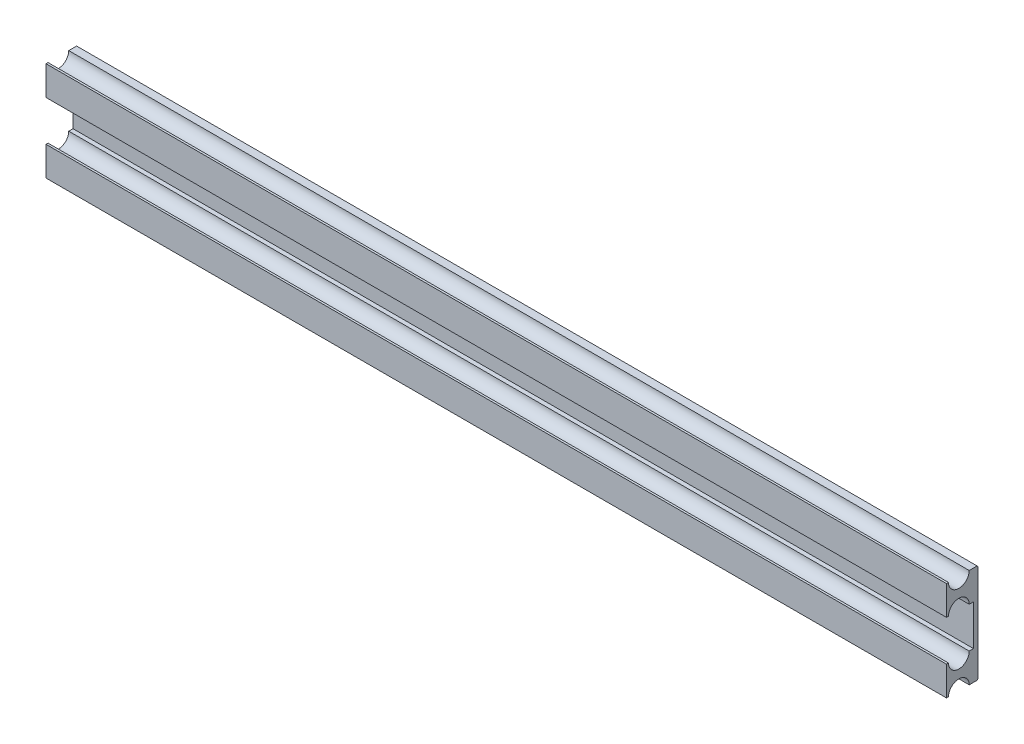
ISO-10303-21;
HEADER;
FILE_DESCRIPTION(('STEP AP214'),'2;1');
FILE_NAME('part.step','',(''),(''),'','','');
FILE_SCHEMA(('AUTOMOTIVE_DESIGN { 1 0 10303 214 1 1 1 1 }'));
ENDSEC;
DATA;
#1=APPLICATION_CONTEXT('core data for automotive mechanical design processes');
#2=APPLICATION_PROTOCOL_DEFINITION('international standard','automotive_design',2000,#1);
#3=PRODUCT_CONTEXT('',#1,'mechanical');
#4=PRODUCT('Part','Part','',(#3));
#5=PRODUCT_RELATED_PRODUCT_CATEGORY('part','',(#4));
#6=PRODUCT_DEFINITION_FORMATION('','',#4);
#7=PRODUCT_DEFINITION_CONTEXT('part definition',#1,'design');
#8=PRODUCT_DEFINITION('design','',#6,#7);
#9=PRODUCT_DEFINITION_SHAPE('','',#8);
#10=(LENGTH_UNIT() NAMED_UNIT(*) SI_UNIT(.MILLI.,.METRE.));
#11=(NAMED_UNIT(*) PLANE_ANGLE_UNIT() SI_UNIT($,.RADIAN.));
#12=(NAMED_UNIT(*) SI_UNIT($,.STERADIAN.) SOLID_ANGLE_UNIT());
#13=UNCERTAINTY_MEASURE_WITH_UNIT(LENGTH_MEASURE(1.E-05),#10,'distance_accuracy_value','');
#14=(GEOMETRIC_REPRESENTATION_CONTEXT(3) GLOBAL_UNCERTAINTY_ASSIGNED_CONTEXT((#13)) GLOBAL_UNIT_ASSIGNED_CONTEXT((#10,
#11,#12)) REPRESENTATION_CONTEXT('',''));
#15=CARTESIAN_POINT('',(0.,0.,0.));
#16=DIRECTION('',(0.,0.,1.));
#17=DIRECTION('',(1.,0.,0.));
#18=AXIS2_PLACEMENT_3D('',#15,#16,#17);
#19=CARTESIAN_POINT('',(100.,-11.,-1.));
#20=DIRECTION('',(0.,-1.,0.));
#21=DIRECTION('',(0.,0.,-1.));
#22=AXIS2_PLACEMENT_3D('',#19,#20,#21);
#23=PLANE('',#22);
#24=DIRECTION('',(0.,0.,1.));
#25=VECTOR('',#24,1.);
#26=CARTESIAN_POINT('',(-100.,-11.,-1.));
#27=LINE('',#26,#25);
#28=CARTESIAN_POINT('',(-100.,-11.,-0.799999999999994));
#29=VERTEX_POINT('',#28);
#30=CARTESIAN_POINT('',(-100.,-11.,0.95));
#31=VERTEX_POINT('',#30);
#32=EDGE_CURVE('E302',#29,#31,#27,.T.);
#33=ORIENTED_EDGE('',*,*,#32,.F.);
#34=DIRECTION('',(1.,0.,0.));
#35=VECTOR('',#34,1.);
#36=CARTESIAN_POINT('',(100.,-11.,-0.799999999999994));
#37=LINE('',#36,#35);
#38=CARTESIAN_POINT('',(100.,-11.,-0.799999999999994));
#39=VERTEX_POINT('',#38);
#40=EDGE_CURVE('E183',#29,#39,#37,.T.);
#41=ORIENTED_EDGE('',*,*,#40,.T.);
#42=DIRECTION('',(0.,0.,1.));
#43=VECTOR('',#42,1.);
#44=CARTESIAN_POINT('',(100.,-11.,-1.));
#45=LINE('',#44,#43);
#46=CARTESIAN_POINT('',(100.,-11.,0.95));
#47=VERTEX_POINT('',#46);
#48=EDGE_CURVE('E178',#39,#47,#45,.T.);
#49=ORIENTED_EDGE('',*,*,#48,.T.);
#50=DIRECTION('',(1.,0.,0.));
#51=VECTOR('',#50,1.);
#52=CARTESIAN_POINT('',(-100.,-11.,0.95));
#53=LINE('',#52,#51);
#54=EDGE_CURVE('E181',#31,#47,#53,.T.);
#55=ORIENTED_EDGE('',*,*,#54,.F.);
#56=EDGE_LOOP('',(#33,#41,#49,#55));
#57=FACE_BOUND('',#56,.T.);
#58=ADVANCED_FACE('F45',(#57),#23,.T.);
#59=CARTESIAN_POINT('',(100.,-4.49999999999997,207.105597123119));
#60=DIRECTION('',(0.,-1.,0.));
#61=DIRECTION('',(1.,0.,0.));
#62=AXIS2_PLACEMENT_3D('',#59,#60,#61);
#63=PLANE('',#62);
#64=DIRECTION('',(1.,0.,0.));
#65=VECTOR('',#64,1.);
#66=CARTESIAN_POINT('',(-100.,-4.5,0.95));
#67=LINE('',#66,#65);
#68=CARTESIAN_POINT('',(100.,-4.49999999999997,0.95));
#69=VERTEX_POINT('',#68);
#70=CARTESIAN_POINT('',(-100.,-4.5,0.95));
#71=VERTEX_POINT('',#70);
#72=EDGE_CURVE('E314',#69,#71,#67,.F.);
#73=ORIENTED_EDGE('',*,*,#72,.F.);
#74=DIRECTION('',(0.,0.,-1.));
#75=VECTOR('',#74,1.);
#76=CARTESIAN_POINT('',(100.,-4.49999999999997,207.105597123119));
#77=LINE('',#76,#75);
#78=CARTESIAN_POINT('',(100.,-4.49999999999997,0.));
#79=VERTEX_POINT('',#78);
#80=EDGE_CURVE('E242',#69,#79,#77,.T.);
#81=ORIENTED_EDGE('',*,*,#80,.T.);
#82=DIRECTION('',(-1.,0.,0.));
#83=VECTOR('',#82,1.);
#84=CARTESIAN_POINT('',(100.,-4.49999999999997,0.));
#85=LINE('',#84,#83);
#86=CARTESIAN_POINT('',(-100.,-4.49999999999997,0.));
#87=VERTEX_POINT('',#86);
#88=EDGE_CURVE('E236',#79,#87,#85,.T.);
#89=ORIENTED_EDGE('',*,*,#88,.T.);
#90=DIRECTION('',(0.,0.,-1.));
#91=VECTOR('',#90,1.);
#92=CARTESIAN_POINT('',(-100.,-4.5,207.105597123119));
#93=LINE('',#92,#91);
#94=EDGE_CURVE('E237',#71,#87,#93,.T.);
#95=ORIENTED_EDGE('',*,*,#94,.F.);
#96=EDGE_LOOP('',(#73,#81,#89,#95));
#97=FACE_BOUND('',#96,.T.);
#98=ADVANCED_FACE('F375',(#97),#63,.F.);
#99=DIRECTION('',(1.,0.,0.));
#100=VECTOR('',#99,1.);
#101=CARTESIAN_POINT('',(-100.,-4.5,5.55));
#102=LINE('',#101,#100);
#103=CARTESIAN_POINT('',(-100.,-4.5,5.55));
#104=VERTEX_POINT('',#103);
#105=CARTESIAN_POINT('',(100.,-4.49999999999997,5.55));
#106=VERTEX_POINT('',#105);
#107=EDGE_CURVE('E311',#104,#106,#102,.T.);
#108=ORIENTED_EDGE('',*,*,#107,.F.);
#109=CARTESIAN_POINT('',(-100.,-4.5,6.00000000000001));
#110=VERTEX_POINT('',#109);
#111=EDGE_CURVE('E233',#110,#104,#93,.T.);
#112=ORIENTED_EDGE('',*,*,#111,.F.);
#113=DIRECTION('',(-1.,0.,0.));
#114=VECTOR('',#113,1.);
#115=CARTESIAN_POINT('',(100.,-4.49999999999997,6.00000000000001));
#116=LINE('',#115,#114);
#117=CARTESIAN_POINT('',(100.,-4.49999999999997,6.00000000000001));
#118=VERTEX_POINT('',#117);
#119=EDGE_CURVE('E250',#118,#110,#116,.T.);
#120=ORIENTED_EDGE('',*,*,#119,.F.);
#121=EDGE_CURVE('E238',#118,#106,#77,.T.);
#122=ORIENTED_EDGE('',*,*,#121,.T.);
#123=EDGE_LOOP('',(#108,#112,#120,#122));
#124=FACE_BOUND('',#123,.T.);
#125=ADVANCED_FACE('F383',(#124),#63,.F.);
#126=CARTESIAN_POINT('',(100.,11.,-1.));
#127=DIRECTION('',(0.,1.,0.));
#128=DIRECTION('',(0.,0.,1.));
#129=AXIS2_PLACEMENT_3D('',#126,#127,#128);
#130=PLANE('',#129);
#131=DIRECTION('',(0.,0.,1.));
#132=VECTOR('',#131,1.);
#133=CARTESIAN_POINT('',(100.,11.,-1.));
#134=LINE('',#133,#132);
#135=CARTESIAN_POINT('',(100.,11.,5.55));
#136=VERTEX_POINT('',#135);
#137=CARTESIAN_POINT('',(100.,11.,6.00000000000001));
#138=VERTEX_POINT('',#137);
#139=EDGE_CURVE('E187',#136,#138,#134,.T.);
#140=ORIENTED_EDGE('',*,*,#139,.F.);
#141=DIRECTION('',(1.,0.,0.));
#142=VECTOR('',#141,1.);
#143=CARTESIAN_POINT('',(-100.,11.,5.55));
#144=LINE('',#143,#142);
#145=CARTESIAN_POINT('',(-100.,11.,5.55));
#146=VERTEX_POINT('',#145);
#147=EDGE_CURVE('E223',#136,#146,#144,.F.);
#148=ORIENTED_EDGE('',*,*,#147,.T.);
#149=DIRECTION('',(0.,0.,1.));
#150=VECTOR('',#149,1.);
#151=CARTESIAN_POINT('',(-100.,11.,-1.));
#152=LINE('',#151,#150);
#153=CARTESIAN_POINT('',(-100.,10.9999999999999,6.00000000000001));
#154=VERTEX_POINT('',#153);
#155=EDGE_CURVE('E299',#146,#154,#152,.T.);
#156=ORIENTED_EDGE('',*,*,#155,.T.);
#157=DIRECTION('',(-1.,0.,0.));
#158=VECTOR('',#157,1.);
#159=CARTESIAN_POINT('',(100.,11.,6.00000000000001));
#160=LINE('',#159,#158);
#161=EDGE_CURVE('E269',#138,#154,#160,.T.);
#162=ORIENTED_EDGE('',*,*,#161,.F.);
#163=EDGE_LOOP('',(#140,#148,#156,#162));
#164=FACE_BOUND('',#163,.T.);
#165=ADVANCED_FACE('F351',(#164),#130,.T.);
#166=CARTESIAN_POINT('',(100.,11.,-0.799999999999994));
#167=VERTEX_POINT('',#166);
#168=CARTESIAN_POINT('',(100.,11.,0.95));
#169=VERTEX_POINT('',#168);
#170=EDGE_CURVE('E300',#167,#169,#134,.T.);
#171=ORIENTED_EDGE('',*,*,#170,.F.);
#172=DIRECTION('',(-1.,0.,0.));
#173=VECTOR('',#172,1.);
#174=CARTESIAN_POINT('',(100.,11.,-0.799999999999994));
#175=LINE('',#174,#173);
#176=CARTESIAN_POINT('',(-100.,11.,-0.799999999999994));
#177=VERTEX_POINT('',#176);
#178=EDGE_CURVE('E11',#167,#177,#175,.T.);
#179=ORIENTED_EDGE('',*,*,#178,.T.);
#180=CARTESIAN_POINT('',(-100.,11.,0.95));
#181=VERTEX_POINT('',#180);
#182=EDGE_CURVE('E296',#177,#181,#152,.T.);
#183=ORIENTED_EDGE('',*,*,#182,.T.);
#184=DIRECTION('',(1.,0.,0.));
#185=VECTOR('',#184,1.);
#186=CARTESIAN_POINT('',(-100.,11.,0.95));
#187=LINE('',#186,#185);
#188=EDGE_CURVE('E219',#181,#169,#187,.T.);
#189=ORIENTED_EDGE('',*,*,#188,.T.);
#190=EDGE_LOOP('',(#171,#179,#183,#189));
#191=FACE_BOUND('',#190,.T.);
#192=ADVANCED_FACE('F340',(#191),#130,.T.);
#193=CARTESIAN_POINT('',(100.,4.49999999999997,207.105597123119));
#194=DIRECTION('',(0.,1.,0.));
#195=DIRECTION('',(-1.,0.,0.));
#196=AXIS2_PLACEMENT_3D('',#193,#194,#195);
#197=PLANE('',#196);
#198=DIRECTION('',(0.,0.,-1.));
#199=VECTOR('',#198,1.);
#200=CARTESIAN_POINT('',(-100.,4.49999999999995,207.105597123119));
#201=LINE('',#200,#199);
#202=CARTESIAN_POINT('',(-100.,4.49999999999995,6.00000000000001));
#203=VERTEX_POINT('',#202);
#204=CARTESIAN_POINT('',(-100.,4.49999999999995,5.55));
#205=VERTEX_POINT('',#204);
#206=EDGE_CURVE('E264',#203,#205,#201,.T.);
#207=ORIENTED_EDGE('',*,*,#206,.T.);
#208=DIRECTION('',(1.,0.,0.));
#209=VECTOR('',#208,1.);
#210=CARTESIAN_POINT('',(-100.,4.49999999999995,5.55));
#211=LINE('',#210,#209);
#212=CARTESIAN_POINT('',(100.,4.49999999999997,5.55));
#213=VERTEX_POINT('',#212);
#214=EDGE_CURVE('E307',#205,#213,#211,.T.);
#215=ORIENTED_EDGE('',*,*,#214,.T.);
#216=DIRECTION('',(0.,0.,-1.));
#217=VECTOR('',#216,1.);
#218=CARTESIAN_POINT('',(100.,4.49999999999997,207.105597123119));
#219=LINE('',#218,#217);
#220=CARTESIAN_POINT('',(100.,4.49999999999997,6.00000000000001));
#221=VERTEX_POINT('',#220);
#222=EDGE_CURVE('E282',#221,#213,#219,.T.);
#223=ORIENTED_EDGE('',*,*,#222,.F.);
#224=DIRECTION('',(1.,0.,0.));
#225=VECTOR('',#224,1.);
#226=CARTESIAN_POINT('',(100.,4.49999999999997,6.00000000000001));
#227=LINE('',#226,#225);
#228=EDGE_CURVE('E263',#203,#221,#227,.T.);
#229=ORIENTED_EDGE('',*,*,#228,.F.);
#230=EDGE_LOOP('',(#207,#215,#223,#229));
#231=FACE_BOUND('',#230,.T.);
#232=ADVANCED_FACE('F358',(#231),#197,.F.);
#233=CARTESIAN_POINT('',(0.,0.,0.));
#234=DIRECTION('',(0.,0.,-1.));
#235=DIRECTION('',(-1.,0.,0.));
#236=AXIS2_PLACEMENT_3D('',#233,#234,#235);
#237=PLANE('',#236);
#238=ORIENTED_EDGE('',*,*,#88,.F.);
#239=DIRECTION('',(0.,1.,0.));
#240=VECTOR('',#239,1.);
#241=CARTESIAN_POINT('',(100.,11.,0.));
#242=LINE('',#241,#240);
#243=CARTESIAN_POINT('',(100.,4.49999999999997,0.));
#244=VERTEX_POINT('',#243);
#245=EDGE_CURVE('E288',#79,#244,#242,.T.);
#246=ORIENTED_EDGE('',*,*,#245,.T.);
#247=DIRECTION('',(1.,0.,0.));
#248=VECTOR('',#247,1.);
#249=CARTESIAN_POINT('',(100.,4.49999999999997,0.));
#250=LINE('',#249,#248);
#251=CARTESIAN_POINT('',(-100.,4.49999999999996,0.));
#252=VERTEX_POINT('',#251);
#253=EDGE_CURVE('E259',#252,#244,#250,.T.);
#254=ORIENTED_EDGE('',*,*,#253,.F.);
#255=DIRECTION('',(0.,-1.,0.));
#256=VECTOR('',#255,1.);
#257=CARTESIAN_POINT('',(-100.,11.,0.));
#258=LINE('',#257,#256);
#259=EDGE_CURVE('E268',#252,#87,#258,.T.);
#260=ORIENTED_EDGE('',*,*,#259,.T.);
#261=EDGE_LOOP('',(#238,#246,#254,#260));
#262=FACE_BOUND('',#261,.T.);
#263=ADVANCED_FACE('F369',(#262),#237,.F.);
#264=CARTESIAN_POINT('',(-100.,11.,-1.));
#265=DIRECTION('',(-1.,0.,0.));
#266=DIRECTION('',(0.,0.,1.));
#267=AXIS2_PLACEMENT_3D('',#264,#265,#266);
#268=PLANE('',#267);
#269=DIRECTION('',(0.,-1.,0.));
#270=VECTOR('',#269,1.);
#271=CARTESIAN_POINT('',(-100.,11.,-1.));
#272=LINE('',#271,#270);
#273=CARTESIAN_POINT('',(-100.,10.8,-1.));
#274=VERTEX_POINT('',#273);
#275=CARTESIAN_POINT('',(-100.,-10.8,-1.));
#276=VERTEX_POINT('',#275);
#277=EDGE_CURVE('E285',#274,#276,#272,.T.);
#278=ORIENTED_EDGE('',*,*,#277,.T.);
#279=DIRECTION('',(0.,0.707106781186548,-0.707106781186548));
#280=VECTOR('',#279,1.);
#281=CARTESIAN_POINT('',(-100.,0.100000000000003,-11.9));
#282=LINE('',#281,#280);
#283=EDGE_CURVE('E55',#276,#29,#282,.F.);
#284=ORIENTED_EDGE('',*,*,#283,.T.);
#285=ORIENTED_EDGE('',*,*,#32,.T.);
#286=CARTESIAN_POINT('',(-100.,-10.9999999999999,3.25));
#287=DIRECTION('',(1.,0.,0.));
#288=DIRECTION('',(0.,0.,-1.));
#289=AXIS2_PLACEMENT_3D('',#286,#287,#288);
#290=CIRCLE('',#289,2.3);
#291=CARTESIAN_POINT('',(-100.,-11.,5.55));
#292=VERTEX_POINT('',#291);
#293=EDGE_CURVE('E196',#31,#292,#290,.T.);
#294=ORIENTED_EDGE('',*,*,#293,.T.);
#295=CARTESIAN_POINT('',(-100.,-11.,6.00000000000001));
#296=VERTEX_POINT('',#295);
#297=EDGE_CURVE('E291',#292,#296,#27,.T.);
#298=ORIENTED_EDGE('',*,*,#297,.T.);
#299=DIRECTION('',(0.,-1.,0.));
#300=VECTOR('',#299,1.);
#301=CARTESIAN_POINT('',(-100.,-11.,6.00000000000001));
#302=LINE('',#301,#300);
#303=EDGE_CURVE('E232',#110,#296,#302,.T.);
#304=ORIENTED_EDGE('',*,*,#303,.F.);
#305=ORIENTED_EDGE('',*,*,#111,.T.);
#306=CARTESIAN_POINT('',(-100.,-4.5,3.25));
#307=DIRECTION('',(-1.,0.,0.));
#308=DIRECTION('',(0.,0.,-1.));
#309=AXIS2_PLACEMENT_3D('',#306,#307,#308);
#310=CIRCLE('',#309,2.3);
#311=EDGE_CURVE('E212',#71,#104,#310,.T.);
#312=ORIENTED_EDGE('',*,*,#311,.F.);
#313=ORIENTED_EDGE('',*,*,#94,.T.);
#314=ORIENTED_EDGE('',*,*,#259,.F.);
#315=CARTESIAN_POINT('',(-100.,4.49999999999995,0.950000000000006));
#316=VERTEX_POINT('',#315);
#317=EDGE_CURVE('E281',#316,#252,#201,.T.);
#318=ORIENTED_EDGE('',*,*,#317,.F.);
#319=CARTESIAN_POINT('',(-100.,4.5,3.25));
#320=DIRECTION('',(1.,0.,0.));
#321=DIRECTION('',(0.,0.,-1.));
#322=AXIS2_PLACEMENT_3D('',#319,#320,#321);
#323=CIRCLE('',#322,2.3);
#324=EDGE_CURVE('E229',#316,#205,#323,.T.);
#325=ORIENTED_EDGE('',*,*,#324,.T.);
#326=ORIENTED_EDGE('',*,*,#206,.F.);
#327=DIRECTION('',(0.,-1.,0.));
#328=VECTOR('',#327,1.);
#329=CARTESIAN_POINT('',(-100.,10.9999999999999,6.00000000000001));
#330=LINE('',#329,#328);
#331=EDGE_CURVE('E265',#154,#203,#330,.T.);
#332=ORIENTED_EDGE('',*,*,#331,.F.);
#333=ORIENTED_EDGE('',*,*,#155,.F.);
#334=CARTESIAN_POINT('',(-100.,10.9999999999999,3.25));
#335=DIRECTION('',(-1.,0.,0.));
#336=DIRECTION('',(0.,0.,-1.));
#337=AXIS2_PLACEMENT_3D('',#334,#335,#336);
#338=CIRCLE('',#337,2.3);
#339=EDGE_CURVE('E217',#181,#146,#338,.T.);
#340=ORIENTED_EDGE('',*,*,#339,.F.);
#341=ORIENTED_EDGE('',*,*,#182,.F.);
#342=DIRECTION('',(0.,0.707106781186548,0.707106781186548));
#343=VECTOR('',#342,1.);
#344=CARTESIAN_POINT('',(-100.,10.9,-0.899999999999997));
#345=LINE('',#344,#343);
#346=EDGE_CURVE('E62',#177,#274,#345,.F.);
#347=ORIENTED_EDGE('',*,*,#346,.T.);
#348=EDGE_LOOP('',(#278,#284,#285,#294,#298,#304,#305,#312,#313,#314,#318,#325,#326,#332,#333,
#340,#341,#347));
#349=FACE_BOUND('',#348,.T.);
#350=ADVANCED_FACE('F332',(#349),#268,.T.);
#351=CARTESIAN_POINT('',(100.,11.,-1.));
#352=DIRECTION('',(1.,0.,0.));
#353=DIRECTION('',(0.,0.,-1.));
#354=AXIS2_PLACEMENT_3D('',#351,#352,#353);
#355=PLANE('',#354);
#356=ORIENTED_EDGE('',*,*,#48,.F.);
#357=DIRECTION('',(0.,-0.707106781186548,0.707106781186548));
#358=VECTOR('',#357,1.);
#359=CARTESIAN_POINT('',(100.,0.100000000000003,-11.9));
#360=LINE('',#359,#358);
#361=CARTESIAN_POINT('',(100.,-10.8,-1.));
#362=VERTEX_POINT('',#361);
#363=EDGE_CURVE('E323',#39,#362,#360,.F.);
#364=ORIENTED_EDGE('',*,*,#363,.T.);
#365=DIRECTION('',(0.,1.,0.));
#366=VECTOR('',#365,1.);
#367=CARTESIAN_POINT('',(100.,11.,-1.));
#368=LINE('',#367,#366);
#369=CARTESIAN_POINT('',(100.,10.8,-1.));
#370=VERTEX_POINT('',#369);
#371=EDGE_CURVE('E287',#362,#370,#368,.T.);
#372=ORIENTED_EDGE('',*,*,#371,.T.);
#373=DIRECTION('',(0.,-0.707106781186548,-0.707106781186548));
#374=VECTOR('',#373,1.);
#375=CARTESIAN_POINT('',(100.,10.9,-0.899999999999997));
#376=LINE('',#375,#374);
#377=EDGE_CURVE('E321',#370,#167,#376,.F.);
#378=ORIENTED_EDGE('',*,*,#377,.T.);
#379=ORIENTED_EDGE('',*,*,#170,.T.);
#380=CARTESIAN_POINT('',(100.,10.9999999999999,3.25));
#381=DIRECTION('',(-1.,0.,0.));
#382=DIRECTION('',(0.,0.,-1.));
#383=AXIS2_PLACEMENT_3D('',#380,#381,#382);
#384=CIRCLE('',#383,2.3);
#385=EDGE_CURVE('E214',#169,#136,#384,.T.);
#386=ORIENTED_EDGE('',*,*,#385,.T.);
#387=ORIENTED_EDGE('',*,*,#139,.T.);
#388=DIRECTION('',(0.,1.,0.));
#389=VECTOR('',#388,1.);
#390=CARTESIAN_POINT('',(100.,11.,6.00000000000001));
#391=LINE('',#390,#389);
#392=EDGE_CURVE('E273',#221,#138,#391,.T.);
#393=ORIENTED_EDGE('',*,*,#392,.F.);
#394=ORIENTED_EDGE('',*,*,#222,.T.);
#395=CARTESIAN_POINT('',(100.,4.5,3.25));
#396=DIRECTION('',(1.,0.,0.));
#397=DIRECTION('',(0.,0.,-1.));
#398=AXIS2_PLACEMENT_3D('',#395,#396,#397);
#399=CIRCLE('',#398,2.3);
#400=CARTESIAN_POINT('',(100.,4.49999999999997,0.95));
#401=VERTEX_POINT('',#400);
#402=EDGE_CURVE('E227',#401,#213,#399,.T.);
#403=ORIENTED_EDGE('',*,*,#402,.F.);
#404=EDGE_CURVE('E241',#401,#244,#219,.T.);
#405=ORIENTED_EDGE('',*,*,#404,.T.);
#406=ORIENTED_EDGE('',*,*,#245,.F.);
#407=ORIENTED_EDGE('',*,*,#80,.F.);
#408=CARTESIAN_POINT('',(100.,-4.5,3.25));
#409=DIRECTION('',(-1.,0.,0.));
#410=DIRECTION('',(0.,0.,-1.));
#411=AXIS2_PLACEMENT_3D('',#408,#409,#410);
#412=CIRCLE('',#411,2.3);
#413=EDGE_CURVE('E207',#69,#106,#412,.T.);
#414=ORIENTED_EDGE('',*,*,#413,.T.);
#415=ORIENTED_EDGE('',*,*,#121,.F.);
#416=DIRECTION('',(0.,1.,0.));
#417=VECTOR('',#416,1.);
#418=CARTESIAN_POINT('',(100.,-11.,6.00000000000001));
#419=LINE('',#418,#417);
#420=CARTESIAN_POINT('',(100.,-11.,6.00000000000001));
#421=VERTEX_POINT('',#420);
#422=EDGE_CURVE('E247',#421,#118,#419,.T.);
#423=ORIENTED_EDGE('',*,*,#422,.F.);
#424=CARTESIAN_POINT('',(100.,-11.,5.55));
#425=VERTEX_POINT('',#424);
#426=EDGE_CURVE('E188',#425,#421,#45,.T.);
#427=ORIENTED_EDGE('',*,*,#426,.F.);
#428=CARTESIAN_POINT('',(100.,-10.9999999999999,3.25));
#429=DIRECTION('',(1.,0.,0.));
#430=DIRECTION('',(0.,0.,-1.));
#431=AXIS2_PLACEMENT_3D('',#428,#429,#430);
#432=CIRCLE('',#431,2.3);
#433=EDGE_CURVE('E193',#47,#425,#432,.T.);
#434=ORIENTED_EDGE('',*,*,#433,.F.);
#435=EDGE_LOOP('',(#356,#364,#372,#378,#379,#386,#387,#393,#394,#403,#405,#406,#407,#414,#415,
#423,#427,#434));
#436=FACE_BOUND('',#435,.T.);
#437=ADVANCED_FACE('F201',(#436),#355,.T.);
#438=DIRECTION('',(1.,0.,0.));
#439=VECTOR('',#438,1.);
#440=CARTESIAN_POINT('',(-100.,-11.,5.55));
#441=LINE('',#440,#439);
#442=EDGE_CURVE('E198',#425,#292,#441,.F.);
#443=ORIENTED_EDGE('',*,*,#442,.F.);
#444=ORIENTED_EDGE('',*,*,#426,.T.);
#445=DIRECTION('',(1.,0.,0.));
#446=VECTOR('',#445,1.);
#447=CARTESIAN_POINT('',(100.,-11.,6.00000000000001));
#448=LINE('',#447,#446);
#449=EDGE_CURVE('E243',#296,#421,#448,.T.);
#450=ORIENTED_EDGE('',*,*,#449,.F.);
#451=ORIENTED_EDGE('',*,*,#297,.F.);
#452=EDGE_LOOP('',(#443,#444,#450,#451));
#453=FACE_BOUND('',#452,.T.);
#454=ADVANCED_FACE('F389',(#453),#23,.T.);
#455=CARTESIAN_POINT('',(0.,0.,-1.));
#456=DIRECTION('',(0.,0.,-1.));
#457=DIRECTION('',(-1.,0.,0.));
#458=AXIS2_PLACEMENT_3D('',#455,#456,#457);
#459=PLANE('',#458);
#460=ORIENTED_EDGE('',*,*,#371,.F.);
#461=DIRECTION('',(-1.,0.,0.));
#462=VECTOR('',#461,1.);
#463=CARTESIAN_POINT('',(0.,-10.8,-1.));
#464=LINE('',#463,#462);
#465=EDGE_CURVE('E69',#362,#276,#464,.T.);
#466=ORIENTED_EDGE('',*,*,#465,.T.);
#467=ORIENTED_EDGE('',*,*,#277,.F.);
#468=DIRECTION('',(1.,0.,0.));
#469=VECTOR('',#468,1.);
#470=CARTESIAN_POINT('',(0.,10.8,-1.));
#471=LINE('',#470,#469);
#472=EDGE_CURVE('E325',#274,#370,#471,.T.);
#473=ORIENTED_EDGE('',*,*,#472,.T.);
#474=EDGE_LOOP('',(#460,#466,#467,#473));
#475=FACE_BOUND('',#474,.T.);
#476=ADVANCED_FACE('F336',(#475),#459,.T.);
#477=ORIENTED_EDGE('',*,*,#404,.F.);
#478=DIRECTION('',(1.,0.,0.));
#479=VECTOR('',#478,1.);
#480=CARTESIAN_POINT('',(-100.,4.49999999999995,0.95));
#481=LINE('',#480,#479);
#482=EDGE_CURVE('E298',#401,#316,#481,.F.);
#483=ORIENTED_EDGE('',*,*,#482,.T.);
#484=ORIENTED_EDGE('',*,*,#317,.T.);
#485=ORIENTED_EDGE('',*,*,#253,.T.);
#486=EDGE_LOOP('',(#477,#483,#484,#485));
#487=FACE_BOUND('',#486,.T.);
#488=ADVANCED_FACE('F366',(#487),#197,.F.);
#489=CARTESIAN_POINT('',(0.,0.,6.));
#490=DIRECTION('',(0.,0.,1.));
#491=DIRECTION('',(1.,0.,0.));
#492=AXIS2_PLACEMENT_3D('',#489,#490,#491);
#493=PLANE('',#492);
#494=ORIENTED_EDGE('',*,*,#228,.T.);
#495=ORIENTED_EDGE('',*,*,#392,.T.);
#496=ORIENTED_EDGE('',*,*,#161,.T.);
#497=ORIENTED_EDGE('',*,*,#331,.T.);
#498=EDGE_LOOP('',(#494,#495,#496,#497));
#499=FACE_BOUND('',#498,.T.);
#500=ADVANCED_FACE('F356',(#499),#493,.T.);
#501=CARTESIAN_POINT('',(0.,0.,6.));
#502=DIRECTION('',(0.,0.,1.));
#503=DIRECTION('',(1.,0.,0.));
#504=AXIS2_PLACEMENT_3D('',#501,#502,#503);
#505=PLANE('',#504);
#506=ORIENTED_EDGE('',*,*,#449,.T.);
#507=ORIENTED_EDGE('',*,*,#422,.T.);
#508=ORIENTED_EDGE('',*,*,#119,.T.);
#509=ORIENTED_EDGE('',*,*,#303,.T.);
#510=EDGE_LOOP('',(#506,#507,#508,#509));
#511=FACE_BOUND('',#510,.T.);
#512=ADVANCED_FACE('F385',(#511),#505,.T.);
#513=CARTESIAN_POINT('',(-100.,4.5,3.25));
#514=DIRECTION('',(1.,0.,0.));
#515=DIRECTION('',(0.,0.,-1.));
#516=AXIS2_PLACEMENT_3D('',#513,#514,#515);
#517=CYLINDRICAL_SURFACE('',#516,2.3);
#518=ORIENTED_EDGE('',*,*,#324,.F.);
#519=ORIENTED_EDGE('',*,*,#482,.F.);
#520=ORIENTED_EDGE('',*,*,#402,.T.);
#521=ORIENTED_EDGE('',*,*,#214,.F.);
#522=EDGE_LOOP('',(#518,#519,#520,#521));
#523=FACE_BOUND('',#522,.T.);
#524=ADVANCED_FACE('F360',(#523),#517,.F.);
#525=CARTESIAN_POINT('',(-100.,10.9999999999999,3.25));
#526=DIRECTION('',(1.,0.,0.));
#527=DIRECTION('',(0.,0.,-1.));
#528=AXIS2_PLACEMENT_3D('',#525,#526,#527);
#529=CYLINDRICAL_SURFACE('',#528,2.3);
#530=ORIENTED_EDGE('',*,*,#385,.F.);
#531=ORIENTED_EDGE('',*,*,#188,.F.);
#532=ORIENTED_EDGE('',*,*,#339,.T.);
#533=ORIENTED_EDGE('',*,*,#147,.F.);
#534=EDGE_LOOP('',(#530,#531,#532,#533));
#535=FACE_BOUND('',#534,.T.);
#536=ADVANCED_FACE('F345',(#535),#529,.F.);
#537=CARTESIAN_POINT('',(-100.,-4.5,3.25));
#538=DIRECTION('',(1.,0.,0.));
#539=DIRECTION('',(0.,0.,-1.));
#540=AXIS2_PLACEMENT_3D('',#537,#538,#539);
#541=CYLINDRICAL_SURFACE('',#540,2.3);
#542=ORIENTED_EDGE('',*,*,#72,.T.);
#543=ORIENTED_EDGE('',*,*,#311,.T.);
#544=ORIENTED_EDGE('',*,*,#107,.T.);
#545=ORIENTED_EDGE('',*,*,#413,.F.);
#546=EDGE_LOOP('',(#542,#543,#544,#545));
#547=FACE_BOUND('',#546,.T.);
#548=ADVANCED_FACE('F379',(#547),#541,.F.);
#549=CARTESIAN_POINT('',(-100.,-10.9999999999999,3.25));
#550=DIRECTION('',(1.,0.,0.));
#551=DIRECTION('',(0.,0.,-1.));
#552=AXIS2_PLACEMENT_3D('',#549,#550,#551);
#553=CYLINDRICAL_SURFACE('',#552,2.3);
#554=ORIENTED_EDGE('',*,*,#54,.T.);
#555=ORIENTED_EDGE('',*,*,#433,.T.);
#556=ORIENTED_EDGE('',*,*,#442,.T.);
#557=ORIENTED_EDGE('',*,*,#293,.F.);
#558=EDGE_LOOP('',(#554,#555,#556,#557));
#559=FACE_BOUND('',#558,.T.);
#560=ADVANCED_FACE('F192',(#559),#553,.F.);
#561=CARTESIAN_POINT('',(100.,-11.,-0.799999999999994));
#562=DIRECTION('',(0.,0.707106781186548,0.707106781186548));
#563=DIRECTION('',(1.,0.,0.));
#564=AXIS2_PLACEMENT_3D('',#561,#562,#563);
#565=PLANE('',#564);
#566=ORIENTED_EDGE('',*,*,#283,.F.);
#567=ORIENTED_EDGE('',*,*,#465,.F.);
#568=ORIENTED_EDGE('',*,*,#363,.F.);
#569=ORIENTED_EDGE('',*,*,#40,.F.);
#570=EDGE_LOOP('',(#566,#567,#568,#569));
#571=FACE_BOUND('',#570,.T.);
#572=ADVANCED_FACE('F334',(#571),#565,.F.);
#573=CARTESIAN_POINT('',(100.,11.,-0.799999999999994));
#574=DIRECTION('',(0.,-0.707106781186548,0.707106781186548));
#575=DIRECTION('',(-1.,0.,0.));
#576=AXIS2_PLACEMENT_3D('',#573,#574,#575);
#577=PLANE('',#576);
#578=ORIENTED_EDGE('',*,*,#377,.F.);
#579=ORIENTED_EDGE('',*,*,#472,.F.);
#580=ORIENTED_EDGE('',*,*,#346,.F.);
#581=ORIENTED_EDGE('',*,*,#178,.F.);
#582=EDGE_LOOP('',(#578,#579,#580,#581));
#583=FACE_BOUND('',#582,.T.);
#584=ADVANCED_FACE('F48',(#583),#577,.F.);
#585=CLOSED_SHELL('',(#58,#98,#125,#165,#192,#232,#263,#350,#437,#454,#476,#488,#500,#512,#524,
#536,#548,#560,#572,#584));
#586=MANIFOLD_SOLID_BREP('B2',#585);
#587=ADVANCED_BREP_SHAPE_REPRESENTATION('',(#18,#586),#14);
#588=SHAPE_DEFINITION_REPRESENTATION(#9,#587);
ENDSEC;
END-ISO-10303-21;
